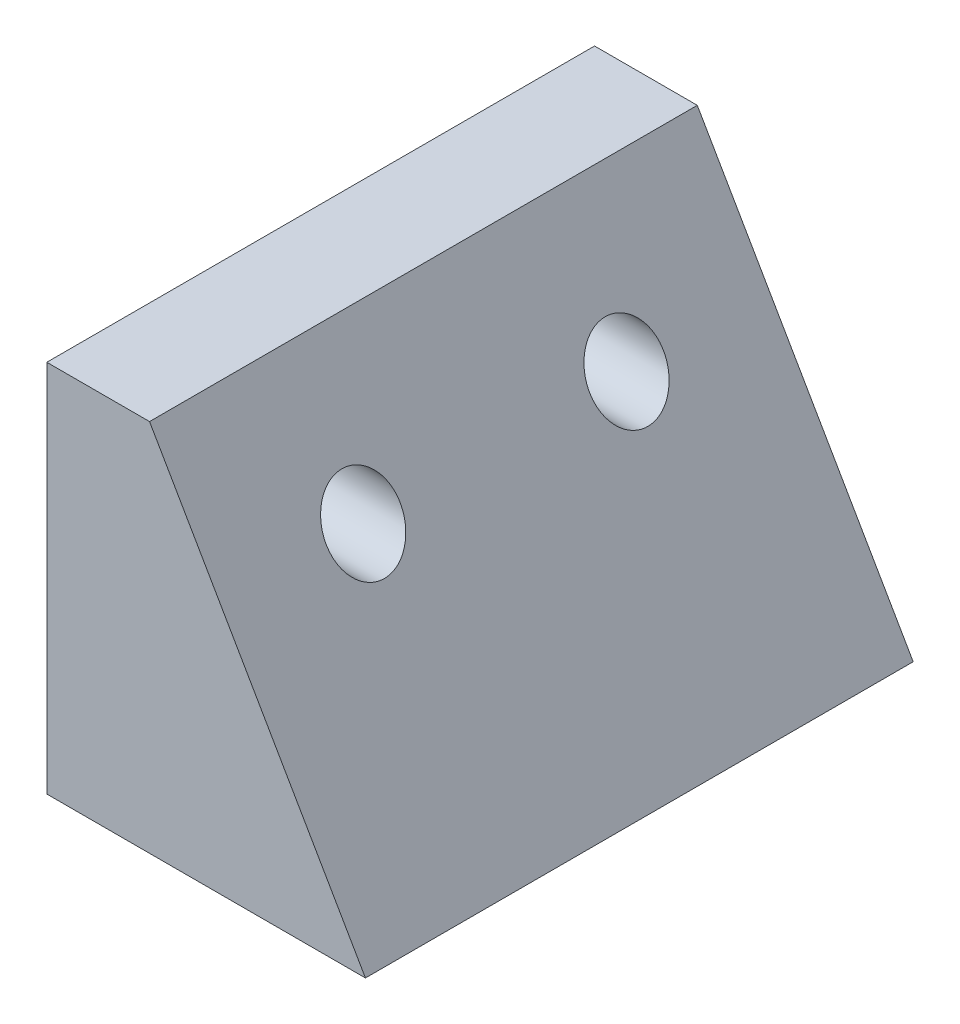
ISO-10303-21;
HEADER;
FILE_DESCRIPTION(('STEP AP214'),'2;1');
FILE_NAME('part.step','',(''),(''),'','','');
FILE_SCHEMA(('AUTOMOTIVE_DESIGN { 1 0 10303 214 1 1 1 1 }'));
ENDSEC;
DATA;
#1=APPLICATION_CONTEXT('core data for automotive mechanical design processes');
#2=APPLICATION_PROTOCOL_DEFINITION('international standard','automotive_design',2000,#1);
#3=PRODUCT_CONTEXT('',#1,'mechanical');
#4=PRODUCT('Part','Part','',(#3));
#5=PRODUCT_RELATED_PRODUCT_CATEGORY('part','',(#4));
#6=PRODUCT_DEFINITION_FORMATION('','',#4);
#7=PRODUCT_DEFINITION_CONTEXT('part definition',#1,'design');
#8=PRODUCT_DEFINITION('design','',#6,#7);
#9=PRODUCT_DEFINITION_SHAPE('','',#8);
#10=(LENGTH_UNIT() NAMED_UNIT(*) SI_UNIT(.MILLI.,.METRE.));
#11=(NAMED_UNIT(*) PLANE_ANGLE_UNIT() SI_UNIT($,.RADIAN.));
#12=(NAMED_UNIT(*) SI_UNIT($,.STERADIAN.) SOLID_ANGLE_UNIT());
#13=UNCERTAINTY_MEASURE_WITH_UNIT(LENGTH_MEASURE(1.E-05),#10,'distance_accuracy_value','');
#14=(GEOMETRIC_REPRESENTATION_CONTEXT(3) GLOBAL_UNCERTAINTY_ASSIGNED_CONTEXT((#13)) GLOBAL_UNIT_ASSIGNED_CONTEXT((#10,
#11,#12)) REPRESENTATION_CONTEXT('',''));
#15=CARTESIAN_POINT('',(0.,0.,0.));
#16=DIRECTION('',(0.,0.,1.));
#17=DIRECTION('',(1.,0.,0.));
#18=AXIS2_PLACEMENT_3D('',#15,#16,#17);
#19=CARTESIAN_POINT('',(-36.6357452136382,1.93704626640955,-5.30328077880912));
#20=DIRECTION('',(0.866025403784438,0.500000000000001,0.));
#21=DIRECTION('',(-0.500000000000001,0.866025403784438,0.));
#22=AXIS2_PLACEMENT_3D('',#19,#20,#21);
#23=PLANE('',#22);
#24=CARTESIAN_POINT('',(-43.4917796602651,13.8120462664095,24.7661827895171));
#25=DIRECTION('',(0.866025403784438,0.500000000000001,0.));
#26=DIRECTION('',(-0.500000000000001,0.866025403784438,0.));
#27=AXIS2_PLACEMENT_3D('',#24,#25,#26);
#28=ELLIPSE('',#27,2.0207259421637,1.75);
#29=CARTESIAN_POINT('',(-44.5021426313469,15.5620462664096,24.7661827895171));
#30=VERTEX_POINT('',#29);
#31=EDGE_CURVE('E113',#30,#30,#28,.T.);
#32=ORIENTED_EDGE('',*,*,#31,.F.);
#33=EDGE_LOOP('',(#32));
#34=FACE_BOUND('',#33,.T.);
#35=CARTESIAN_POINT('',(-43.4917796602651,13.8120462664095,37.2661827895171));
#36=DIRECTION('',(0.866025403784438,0.500000000000001,0.));
#37=DIRECTION('',(-0.500000000000001,0.866025403784438,0.));
#38=AXIS2_PLACEMENT_3D('',#35,#36,#37);
#39=ELLIPSE('',#38,2.02072594216369,1.75);
#40=CARTESIAN_POINT('',(-44.5021426313469,15.5620462664095,37.2661827895171));
#41=VERTEX_POINT('',#40);
#42=EDGE_CURVE('E89',#41,#41,#39,.T.);
#43=ORIENTED_EDGE('',*,*,#42,.F.);
#44=EDGE_LOOP('',(#43));
#45=FACE_BOUND('',#44,.T.);
#46=DIRECTION('',(0.500000000000001,-0.866025403784438,0.));
#47=VECTOR('',#46,1.);
#48=CARTESIAN_POINT('',(-36.6357452136382,1.93704626640955,18.0161827895171));
#49=LINE('',#48,#47);
#50=CARTESIAN_POINT('',(-46.8837124917541,19.6870462664095,18.0161827895171));
#51=VERTEX_POINT('',#50);
#52=CARTESIAN_POINT('',(-36.6357452136382,1.93704626640955,18.0161827895171));
#53=VERTEX_POINT('',#52);
#54=EDGE_CURVE('E40',#51,#53,#49,.T.);
#55=ORIENTED_EDGE('',*,*,#54,.F.);
#56=DIRECTION('',(0.,0.,1.));
#57=VECTOR('',#56,1.);
#58=CARTESIAN_POINT('',(-46.8837124917541,19.6870462664095,-5.30328077880912));
#59=LINE('',#58,#57);
#60=CARTESIAN_POINT('',(-46.8837124917541,19.6870462664095,44.0161827895171));
#61=VERTEX_POINT('',#60);
#62=EDGE_CURVE('E68',#51,#61,#59,.T.);
#63=ORIENTED_EDGE('',*,*,#62,.T.);
#64=DIRECTION('',(-0.500000000000001,0.866025403784438,0.));
#65=VECTOR('',#64,1.);
#66=CARTESIAN_POINT('',(-36.6357452136382,1.93704626640955,44.0161827895171));
#67=LINE('',#66,#65);
#68=CARTESIAN_POINT('',(-36.6357452136382,1.93704626640955,44.0161827895171));
#69=VERTEX_POINT('',#68);
#70=EDGE_CURVE('E72',#69,#61,#67,.T.);
#71=ORIENTED_EDGE('',*,*,#70,.F.);
#72=DIRECTION('',(0.,0.,1.));
#73=VECTOR('',#72,1.);
#74=CARTESIAN_POINT('',(-36.6357452136382,1.93704626640955,-5.30328077880912));
#75=LINE('',#74,#73);
#76=EDGE_CURVE('E99',#53,#69,#75,.T.);
#77=ORIENTED_EDGE('',*,*,#76,.F.);
#78=EDGE_LOOP('',(#55,#63,#71,#77));
#79=FACE_BOUND('',#78,.T.);
#80=ADVANCED_FACE('F32',(#34,#45,#79),#23,.T.);
#81=CARTESIAN_POINT('',(-51.7597288526962,1.93704626640955,-5.30328077880912));
#82=DIRECTION('',(0.,-1.,0.));
#83=DIRECTION('',(0.,0.,-1.));
#84=AXIS2_PLACEMENT_3D('',#81,#82,#83);
#85=PLANE('',#84);
#86=DIRECTION('',(-1.,0.,0.));
#87=VECTOR('',#86,1.);
#88=CARTESIAN_POINT('',(-51.7597288526962,1.93704626640955,18.0161827895171));
#89=LINE('',#88,#87);
#90=CARTESIAN_POINT('',(-51.7597288526962,1.93704626640955,18.0161827895171));
#91=VERTEX_POINT('',#90);
#92=EDGE_CURVE('E46',#53,#91,#89,.T.);
#93=ORIENTED_EDGE('',*,*,#92,.F.);
#94=ORIENTED_EDGE('',*,*,#76,.T.);
#95=DIRECTION('',(1.,0.,0.));
#96=VECTOR('',#95,1.);
#97=CARTESIAN_POINT('',(-51.7597288526962,1.93704626640955,44.0161827895171));
#98=LINE('',#97,#96);
#99=CARTESIAN_POINT('',(-51.7597288526962,1.93704626640955,44.0161827895171));
#100=VERTEX_POINT('',#99);
#101=EDGE_CURVE('E77',#100,#69,#98,.T.);
#102=ORIENTED_EDGE('',*,*,#101,.F.);
#103=DIRECTION('',(0.,0.,1.));
#104=VECTOR('',#103,1.);
#105=CARTESIAN_POINT('',(-51.7597288526962,1.93704626640955,-5.30328077880912));
#106=LINE('',#105,#104);
#107=EDGE_CURVE('E102',#91,#100,#106,.T.);
#108=ORIENTED_EDGE('',*,*,#107,.F.);
#109=EDGE_LOOP('',(#93,#94,#102,#108));
#110=FACE_BOUND('',#109,.T.);
#111=ADVANCED_FACE('F108',(#110),#85,.T.);
#112=CARTESIAN_POINT('',(-51.7597288526962,19.6870462664095,-5.30328077880912));
#113=DIRECTION('',(-1.,0.,0.));
#114=DIRECTION('',(0.,0.,1.));
#115=AXIS2_PLACEMENT_3D('',#112,#113,#114);
#116=PLANE('',#115);
#117=CARTESIAN_POINT('',(-51.7597288526962,13.8120462664095,24.7661827895171));
#118=DIRECTION('',(-1.,0.,0.));
#119=DIRECTION('',(0.,0.,1.));
#120=AXIS2_PLACEMENT_3D('',#117,#118,#119);
#121=CIRCLE('',#120,1.75);
#122=CARTESIAN_POINT('',(-51.7597288526962,13.8120462664095,26.5161827895171));
#123=VERTEX_POINT('',#122);
#124=EDGE_CURVE('E116',#123,#123,#121,.T.);
#125=ORIENTED_EDGE('',*,*,#124,.F.);
#126=EDGE_LOOP('',(#125));
#127=FACE_BOUND('',#126,.T.);
#128=CARTESIAN_POINT('',(-51.7597288526962,13.8120462664095,37.2661827895171));
#129=DIRECTION('',(-1.,0.,0.));
#130=DIRECTION('',(0.,0.,1.));
#131=AXIS2_PLACEMENT_3D('',#128,#129,#130);
#132=CIRCLE('',#131,1.75);
#133=CARTESIAN_POINT('',(-51.7597288526962,13.8120462664095,39.0161827895171));
#134=VERTEX_POINT('',#133);
#135=EDGE_CURVE('E92',#134,#134,#132,.T.);
#136=ORIENTED_EDGE('',*,*,#135,.F.);
#137=EDGE_LOOP('',(#136));
#138=FACE_BOUND('',#137,.T.);
#139=DIRECTION('',(0.,1.,0.));
#140=VECTOR('',#139,1.);
#141=CARTESIAN_POINT('',(-51.7597288526962,19.6870462664095,18.0161827895171));
#142=LINE('',#141,#140);
#143=CARTESIAN_POINT('',(-51.7597288526962,19.6870462664095,18.0161827895171));
#144=VERTEX_POINT('',#143);
#145=EDGE_CURVE('E101',#91,#144,#142,.T.);
#146=ORIENTED_EDGE('',*,*,#145,.F.);
#147=ORIENTED_EDGE('',*,*,#107,.T.);
#148=DIRECTION('',(0.,-1.,0.));
#149=VECTOR('',#148,1.);
#150=CARTESIAN_POINT('',(-51.7597288526962,19.6870462664095,44.0161827895171));
#151=LINE('',#150,#149);
#152=CARTESIAN_POINT('',(-51.7597288526962,19.6870462664095,44.0161827895171));
#153=VERTEX_POINT('',#152);
#154=EDGE_CURVE('E85',#153,#100,#151,.T.);
#155=ORIENTED_EDGE('',*,*,#154,.F.);
#156=DIRECTION('',(0.,0.,1.));
#157=VECTOR('',#156,1.);
#158=CARTESIAN_POINT('',(-51.7597288526962,19.6870462664095,-5.30328077880912));
#159=LINE('',#158,#157);
#160=EDGE_CURVE('E76',#144,#153,#159,.T.);
#161=ORIENTED_EDGE('',*,*,#160,.F.);
#162=EDGE_LOOP('',(#146,#147,#155,#161));
#163=FACE_BOUND('',#162,.T.);
#164=ADVANCED_FACE('F106',(#127,#138,#163),#116,.T.);
#165=CARTESIAN_POINT('',(-46.8837124917541,19.6870462664095,-5.30328077880912));
#166=DIRECTION('',(0.,1.,0.));
#167=DIRECTION('',(0.,0.,1.));
#168=AXIS2_PLACEMENT_3D('',#165,#166,#167);
#169=PLANE('',#168);
#170=DIRECTION('',(1.,0.,0.));
#171=VECTOR('',#170,1.);
#172=CARTESIAN_POINT('',(-46.8837124917541,19.6870462664095,18.0161827895171));
#173=LINE('',#172,#171);
#174=EDGE_CURVE('E11',#144,#51,#173,.T.);
#175=ORIENTED_EDGE('',*,*,#174,.F.);
#176=ORIENTED_EDGE('',*,*,#160,.T.);
#177=DIRECTION('',(-1.,0.,0.));
#178=VECTOR('',#177,1.);
#179=CARTESIAN_POINT('',(-46.8837124917541,19.6870462664095,44.0161827895171));
#180=LINE('',#179,#178);
#181=EDGE_CURVE('E79',#61,#153,#180,.T.);
#182=ORIENTED_EDGE('',*,*,#181,.F.);
#183=ORIENTED_EDGE('',*,*,#62,.F.);
#184=EDGE_LOOP('',(#175,#176,#182,#183));
#185=FACE_BOUND('',#184,.T.);
#186=ADVANCED_FACE('F80',(#185),#169,.T.);
#187=CARTESIAN_POINT('',(0.,0.,44.0161827895171));
#188=DIRECTION('',(0.,0.,1.));
#189=DIRECTION('',(1.,0.,0.));
#190=AXIS2_PLACEMENT_3D('',#187,#188,#189);
#191=PLANE('',#190);
#192=ORIENTED_EDGE('',*,*,#70,.T.);
#193=ORIENTED_EDGE('',*,*,#181,.T.);
#194=ORIENTED_EDGE('',*,*,#154,.T.);
#195=ORIENTED_EDGE('',*,*,#101,.T.);
#196=EDGE_LOOP('',(#192,#193,#194,#195));
#197=FACE_BOUND('',#196,.T.);
#198=ADVANCED_FACE('F87',(#197),#191,.T.);
#199=CARTESIAN_POINT('',(-36.6357452136382,1.93704626640955,18.0161827895171));
#200=DIRECTION('',(0.,0.,1.));
#201=DIRECTION('',(1.,0.,0.));
#202=AXIS2_PLACEMENT_3D('',#199,#200,#201);
#203=PLANE('',#202);
#204=ORIENTED_EDGE('',*,*,#54,.T.);
#205=ORIENTED_EDGE('',*,*,#92,.T.);
#206=ORIENTED_EDGE('',*,*,#145,.T.);
#207=ORIENTED_EDGE('',*,*,#174,.T.);
#208=EDGE_LOOP('',(#204,#205,#206,#207));
#209=FACE_BOUND('',#208,.T.);
#210=ADVANCED_FACE('F129',(#209),#203,.F.);
#211=CARTESIAN_POINT('',(-20.0097288526962,13.8120462664095,37.2661827895171));
#212=DIRECTION('',(-1.,0.,0.));
#213=DIRECTION('',(0.,0.,1.));
#214=AXIS2_PLACEMENT_3D('',#211,#212,#213);
#215=CYLINDRICAL_SURFACE('',#214,1.75);
#216=ORIENTED_EDGE('',*,*,#42,.T.);
#217=EDGE_LOOP('',(#216));
#218=FACE_BOUND('',#217,.T.);
#219=ORIENTED_EDGE('',*,*,#135,.T.);
#220=EDGE_LOOP('',(#219));
#221=FACE_BOUND('',#220,.T.);
#222=ADVANCED_FACE('F127',(#218,#221),#215,.F.);
#223=CARTESIAN_POINT('',(-20.0097288526962,13.8120462664095,24.7661827895171));
#224=DIRECTION('',(-1.,0.,0.));
#225=DIRECTION('',(0.,0.,1.));
#226=AXIS2_PLACEMENT_3D('',#223,#224,#225);
#227=CYLINDRICAL_SURFACE('',#226,1.75);
#228=ORIENTED_EDGE('',*,*,#31,.T.);
#229=EDGE_LOOP('',(#228));
#230=FACE_BOUND('',#229,.T.);
#231=ORIENTED_EDGE('',*,*,#124,.T.);
#232=EDGE_LOOP('',(#231));
#233=FACE_BOUND('',#232,.T.);
#234=ADVANCED_FACE('F120',(#230,#233),#227,.F.);
#235=CLOSED_SHELL('',(#80,#111,#164,#186,#198,#210,#222,#234));
#236=MANIFOLD_SOLID_BREP('B2',#235);
#237=ADVANCED_BREP_SHAPE_REPRESENTATION('',(#18,#236),#14);
#238=SHAPE_DEFINITION_REPRESENTATION(#9,#237);
ENDSEC;
END-ISO-10303-21;
